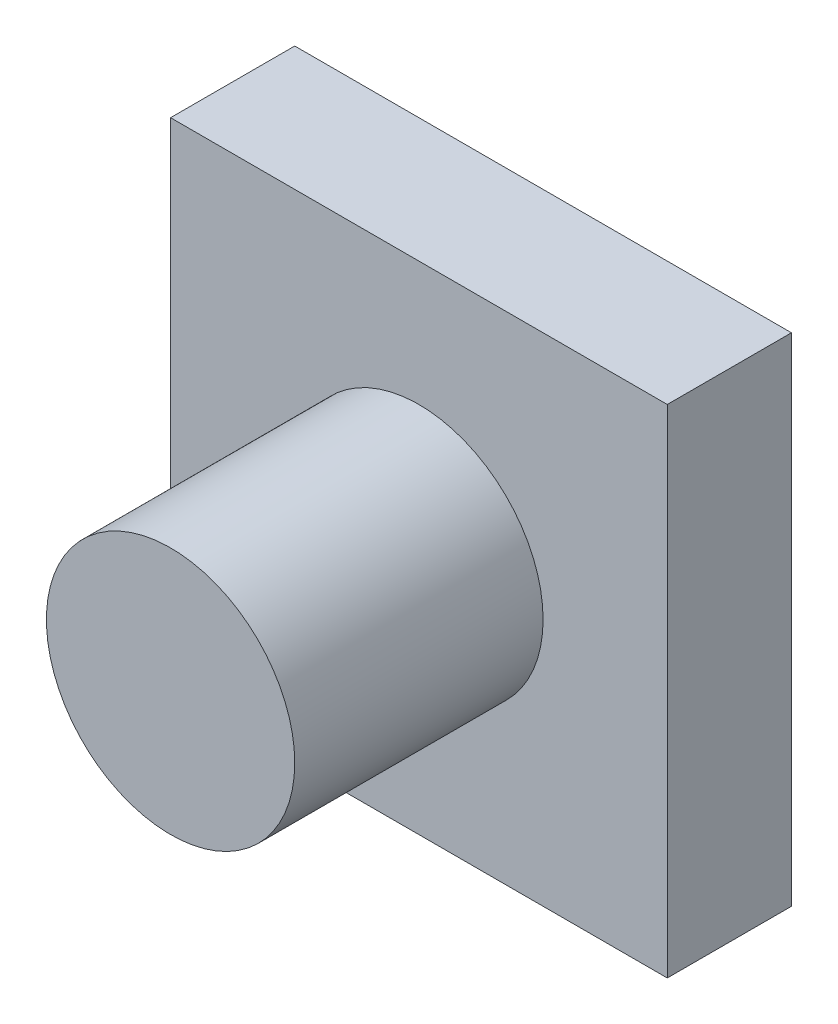
ISO-10303-21;
HEADER;
FILE_DESCRIPTION(('STEP AP214'),'2;1');
FILE_NAME('part.step','',(''),(''),'','','');
FILE_SCHEMA(('AUTOMOTIVE_DESIGN { 1 0 10303 214 1 1 1 1 }'));
ENDSEC;
DATA;
#1=APPLICATION_CONTEXT('core data for automotive mechanical design processes');
#2=APPLICATION_PROTOCOL_DEFINITION('international standard','automotive_design',2000,#1);
#3=PRODUCT_CONTEXT('',#1,'mechanical');
#4=PRODUCT('Part','Part','',(#3));
#5=PRODUCT_RELATED_PRODUCT_CATEGORY('part','',(#4));
#6=PRODUCT_DEFINITION_FORMATION('','',#4);
#7=PRODUCT_DEFINITION_CONTEXT('part definition',#1,'design');
#8=PRODUCT_DEFINITION('design','',#6,#7);
#9=PRODUCT_DEFINITION_SHAPE('','',#8);
#10=(LENGTH_UNIT() NAMED_UNIT(*) SI_UNIT(.MILLI.,.METRE.));
#11=(NAMED_UNIT(*) PLANE_ANGLE_UNIT() SI_UNIT($,.RADIAN.));
#12=(NAMED_UNIT(*) SI_UNIT($,.STERADIAN.) SOLID_ANGLE_UNIT());
#13=UNCERTAINTY_MEASURE_WITH_UNIT(LENGTH_MEASURE(1.E-05),#10,'distance_accuracy_value','');
#14=(GEOMETRIC_REPRESENTATION_CONTEXT(3) GLOBAL_UNCERTAINTY_ASSIGNED_CONTEXT((#13)) GLOBAL_UNIT_ASSIGNED_CONTEXT((#10,
#11,#12)) REPRESENTATION_CONTEXT('',''));
#15=CARTESIAN_POINT('',(0.,0.,0.));
#16=DIRECTION('',(0.,0.,1.));
#17=DIRECTION('',(1.,0.,0.));
#18=AXIS2_PLACEMENT_3D('',#15,#16,#17);
#19=CARTESIAN_POINT('',(20.,-20.,10.));
#20=DIRECTION('',(-1.,0.,0.));
#21=DIRECTION('',(0.,0.,1.));
#22=AXIS2_PLACEMENT_3D('',#19,#20,#21);
#23=PLANE('',#22);
#24=DIRECTION('',(0.,1.,0.));
#25=VECTOR('',#24,1.);
#26=CARTESIAN_POINT('',(20.,-20.,0.));
#27=LINE('',#26,#25);
#28=CARTESIAN_POINT('',(20.,-20.,0.));
#29=VERTEX_POINT('',#28);
#30=CARTESIAN_POINT('',(20.,20.,0.));
#31=VERTEX_POINT('',#30);
#32=EDGE_CURVE('E107',#29,#31,#27,.T.);
#33=ORIENTED_EDGE('',*,*,#32,.T.);
#34=DIRECTION('',(0.,0.,-1.));
#35=VECTOR('',#34,1.);
#36=CARTESIAN_POINT('',(20.,20.,10.));
#37=LINE('',#36,#35);
#38=CARTESIAN_POINT('',(20.,20.,10.));
#39=VERTEX_POINT('',#38);
#40=EDGE_CURVE('E44',#39,#31,#37,.T.);
#41=ORIENTED_EDGE('',*,*,#40,.F.);
#42=DIRECTION('',(0.,1.,0.));
#43=VECTOR('',#42,1.);
#44=CARTESIAN_POINT('',(20.,-20.,10.));
#45=LINE('',#44,#43);
#46=CARTESIAN_POINT('',(20.,-20.,10.));
#47=VERTEX_POINT('',#46);
#48=EDGE_CURVE('E94',#47,#39,#45,.T.);
#49=ORIENTED_EDGE('',*,*,#48,.F.);
#50=DIRECTION('',(0.,0.,-1.));
#51=VECTOR('',#50,1.);
#52=CARTESIAN_POINT('',(20.,-20.,10.));
#53=LINE('',#52,#51);
#54=EDGE_CURVE('E103',#47,#29,#53,.T.);
#55=ORIENTED_EDGE('',*,*,#54,.T.);
#56=EDGE_LOOP('',(#33,#41,#49,#55));
#57=FACE_BOUND('',#56,.T.);
#58=ADVANCED_FACE('F41',(#57),#23,.F.);
#59=CARTESIAN_POINT('',(-20.,20.,10.));
#60=DIRECTION('',(0.,-1.,0.));
#61=DIRECTION('',(0.,0.,-1.));
#62=AXIS2_PLACEMENT_3D('',#59,#60,#61);
#63=PLANE('',#62);
#64=DIRECTION('',(-1.,0.,0.));
#65=VECTOR('',#64,1.);
#66=CARTESIAN_POINT('',(-20.,20.,0.));
#67=LINE('',#66,#65);
#68=CARTESIAN_POINT('',(-20.,20.,0.));
#69=VERTEX_POINT('',#68);
#70=EDGE_CURVE('E99',#31,#69,#67,.T.);
#71=ORIENTED_EDGE('',*,*,#70,.T.);
#72=DIRECTION('',(0.,0.,-1.));
#73=VECTOR('',#72,1.);
#74=CARTESIAN_POINT('',(-20.,20.,10.));
#75=LINE('',#74,#73);
#76=CARTESIAN_POINT('',(-20.,20.,10.));
#77=VERTEX_POINT('',#76);
#78=EDGE_CURVE('E97',#77,#69,#75,.T.);
#79=ORIENTED_EDGE('',*,*,#78,.F.);
#80=DIRECTION('',(-1.,0.,0.));
#81=VECTOR('',#80,1.);
#82=CARTESIAN_POINT('',(-20.,20.,10.));
#83=LINE('',#82,#81);
#84=EDGE_CURVE('E89',#39,#77,#83,.T.);
#85=ORIENTED_EDGE('',*,*,#84,.F.);
#86=ORIENTED_EDGE('',*,*,#40,.T.);
#87=EDGE_LOOP('',(#71,#79,#85,#86));
#88=FACE_BOUND('',#87,.T.);
#89=ADVANCED_FACE('F98',(#88),#63,.F.);
#90=CARTESIAN_POINT('',(-20.,-20.,10.));
#91=DIRECTION('',(1.,0.,0.));
#92=DIRECTION('',(0.,0.,-1.));
#93=AXIS2_PLACEMENT_3D('',#90,#91,#92);
#94=PLANE('',#93);
#95=DIRECTION('',(0.,-1.,0.));
#96=VECTOR('',#95,1.);
#97=CARTESIAN_POINT('',(-20.,-20.,0.));
#98=LINE('',#97,#96);
#99=CARTESIAN_POINT('',(-20.,-20.,0.));
#100=VERTEX_POINT('',#99);
#101=EDGE_CURVE('E75',#69,#100,#98,.T.);
#102=ORIENTED_EDGE('',*,*,#101,.T.);
#103=DIRECTION('',(0.,0.,-1.));
#104=VECTOR('',#103,1.);
#105=CARTESIAN_POINT('',(-20.,-20.,10.));
#106=LINE('',#105,#104);
#107=CARTESIAN_POINT('',(-20.,-20.,10.));
#108=VERTEX_POINT('',#107);
#109=EDGE_CURVE('E100',#108,#100,#106,.T.);
#110=ORIENTED_EDGE('',*,*,#109,.F.);
#111=DIRECTION('',(0.,-1.,0.));
#112=VECTOR('',#111,1.);
#113=CARTESIAN_POINT('',(-20.,-20.,10.));
#114=LINE('',#113,#112);
#115=EDGE_CURVE('E92',#77,#108,#114,.T.);
#116=ORIENTED_EDGE('',*,*,#115,.F.);
#117=ORIENTED_EDGE('',*,*,#78,.T.);
#118=EDGE_LOOP('',(#102,#110,#116,#117));
#119=FACE_BOUND('',#118,.T.);
#120=ADVANCED_FACE('F101',(#119),#94,.F.);
#121=CARTESIAN_POINT('',(-20.,-20.,10.));
#122=DIRECTION('',(0.,1.,0.));
#123=DIRECTION('',(0.,0.,1.));
#124=AXIS2_PLACEMENT_3D('',#121,#122,#123);
#125=PLANE('',#124);
#126=DIRECTION('',(1.,0.,0.));
#127=VECTOR('',#126,1.);
#128=CARTESIAN_POINT('',(-20.,-20.,0.));
#129=LINE('',#128,#127);
#130=EDGE_CURVE('E81',#100,#29,#129,.T.);
#131=ORIENTED_EDGE('',*,*,#130,.T.);
#132=ORIENTED_EDGE('',*,*,#54,.F.);
#133=DIRECTION('',(1.,0.,0.));
#134=VECTOR('',#133,1.);
#135=CARTESIAN_POINT('',(-20.,-20.,10.));
#136=LINE('',#135,#134);
#137=EDGE_CURVE('E58',#108,#47,#136,.T.);
#138=ORIENTED_EDGE('',*,*,#137,.F.);
#139=ORIENTED_EDGE('',*,*,#109,.T.);
#140=EDGE_LOOP('',(#131,#132,#138,#139));
#141=FACE_BOUND('',#140,.T.);
#142=ADVANCED_FACE('F115',(#141),#125,.F.);
#143=CARTESIAN_POINT('',(0.,0.,10.));
#144=DIRECTION('',(0.,0.,-1.));
#145=DIRECTION('',(-1.,0.,0.));
#146=AXIS2_PLACEMENT_3D('',#143,#144,#145);
#147=PLANE('',#146);
#148=CARTESIAN_POINT('',(0.,0.,10.));
#149=DIRECTION('',(0.,0.,1.));
#150=DIRECTION('',(1.,0.,0.));
#151=AXIS2_PLACEMENT_3D('',#148,#149,#150);
#152=CIRCLE('',#151,10.);
#153=CARTESIAN_POINT('',(10.,0.,10.));
#154=VERTEX_POINT('',#153);
#155=EDGE_CURVE('E11',#154,#154,#152,.T.);
#156=ORIENTED_EDGE('',*,*,#155,.F.);
#157=EDGE_LOOP('',(#156));
#158=FACE_BOUND('',#157,.T.);
#159=ORIENTED_EDGE('',*,*,#48,.T.);
#160=ORIENTED_EDGE('',*,*,#84,.T.);
#161=ORIENTED_EDGE('',*,*,#115,.T.);
#162=ORIENTED_EDGE('',*,*,#137,.T.);
#163=EDGE_LOOP('',(#159,#160,#161,#162));
#164=FACE_BOUND('',#163,.T.);
#165=ADVANCED_FACE('F90',(#158,#164),#147,.F.);
#166=CARTESIAN_POINT('',(0.,0.,0.));
#167=DIRECTION('',(0.,0.,-1.));
#168=DIRECTION('',(-1.,0.,0.));
#169=AXIS2_PLACEMENT_3D('',#166,#167,#168);
#170=PLANE('',#169);
#171=ORIENTED_EDGE('',*,*,#32,.F.);
#172=ORIENTED_EDGE('',*,*,#130,.F.);
#173=ORIENTED_EDGE('',*,*,#101,.F.);
#174=ORIENTED_EDGE('',*,*,#70,.F.);
#175=EDGE_LOOP('',(#171,#172,#173,#174));
#176=FACE_BOUND('',#175,.T.);
#177=ADVANCED_FACE('F118',(#176),#170,.T.);
#178=CARTESIAN_POINT('',(0.,0.,30.));
#179=DIRECTION('',(0.,0.,-1.));
#180=DIRECTION('',(-1.,0.,0.));
#181=AXIS2_PLACEMENT_3D('',#178,#179,#180);
#182=CYLINDRICAL_SURFACE('',#181,10.);
#183=CARTESIAN_POINT('',(0.,0.,30.));
#184=DIRECTION('',(0.,0.,1.));
#185=DIRECTION('',(1.,0.,0.));
#186=AXIS2_PLACEMENT_3D('',#183,#184,#185);
#187=CIRCLE('',#186,10.);
#188=CARTESIAN_POINT('',(10.,0.,30.));
#189=VERTEX_POINT('',#188);
#190=EDGE_CURVE('E110',#189,#189,#187,.T.);
#191=ORIENTED_EDGE('',*,*,#190,.F.);
#192=EDGE_LOOP('',(#191));
#193=FACE_BOUND('',#192,.T.);
#194=ORIENTED_EDGE('',*,*,#155,.T.);
#195=EDGE_LOOP('',(#194));
#196=FACE_BOUND('',#195,.T.);
#197=ADVANCED_FACE('F126',(#193,#196),#182,.T.);
#198=CARTESIAN_POINT('',(0.,0.,30.));
#199=DIRECTION('',(0.,0.,1.));
#200=DIRECTION('',(1.,0.,0.));
#201=AXIS2_PLACEMENT_3D('',#198,#199,#200);
#202=PLANE('',#201);
#203=ORIENTED_EDGE('',*,*,#190,.T.);
#204=EDGE_LOOP('',(#203));
#205=FACE_BOUND('',#204,.T.);
#206=ADVANCED_FACE('F124',(#205),#202,.T.);
#207=CLOSED_SHELL('',(#58,#89,#120,#142,#165,#177,#197,#206));
#208=MANIFOLD_SOLID_BREP('B2',#207);
#209=ADVANCED_BREP_SHAPE_REPRESENTATION('',(#18,#208),#14);
#210=SHAPE_DEFINITION_REPRESENTATION(#9,#209);
ENDSEC;
END-ISO-10303-21;
